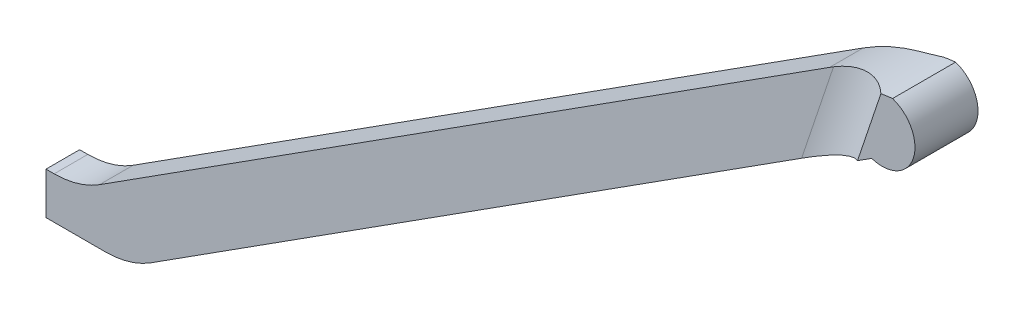
ISO-10303-21;
HEADER;
FILE_DESCRIPTION(('STEP AP214'),'2;1');
FILE_NAME('part.step','',(''),(''),'','','');
FILE_SCHEMA(('AUTOMOTIVE_DESIGN { 1 0 10303 214 1 1 1 1 }'));
ENDSEC;
DATA;
#1=APPLICATION_CONTEXT('core data for automotive mechanical design processes');
#2=APPLICATION_PROTOCOL_DEFINITION('international standard','automotive_design',2000,#1);
#3=PRODUCT_CONTEXT('',#1,'mechanical');
#4=PRODUCT('Part','Part','',(#3));
#5=PRODUCT_RELATED_PRODUCT_CATEGORY('part','',(#4));
#6=PRODUCT_DEFINITION_FORMATION('','',#4);
#7=PRODUCT_DEFINITION_CONTEXT('part definition',#1,'design');
#8=PRODUCT_DEFINITION('design','',#6,#7);
#9=PRODUCT_DEFINITION_SHAPE('','',#8);
#10=(LENGTH_UNIT() NAMED_UNIT(*) SI_UNIT(.MILLI.,.METRE.));
#11=(NAMED_UNIT(*) PLANE_ANGLE_UNIT() SI_UNIT($,.RADIAN.));
#12=(NAMED_UNIT(*) SI_UNIT($,.STERADIAN.) SOLID_ANGLE_UNIT());
#13=UNCERTAINTY_MEASURE_WITH_UNIT(LENGTH_MEASURE(1.E-05),#10,'distance_accuracy_value','');
#14=(GEOMETRIC_REPRESENTATION_CONTEXT(3) GLOBAL_UNCERTAINTY_ASSIGNED_CONTEXT((#13)) GLOBAL_UNIT_ASSIGNED_CONTEXT((#10,
#11,#12)) REPRESENTATION_CONTEXT('',''));
#15=CARTESIAN_POINT('',(0.,0.,0.));
#16=DIRECTION('',(0.,0.,1.));
#17=DIRECTION('',(1.,0.,0.));
#18=AXIS2_PLACEMENT_3D('',#15,#16,#17);
#19=CARTESIAN_POINT('',(0.,0.,0.4));
#20=DIRECTION('',(0.,0.,1.));
#21=DIRECTION('',(1.,0.,0.));
#22=AXIS2_PLACEMENT_3D('',#19,#20,#21);
#23=PLANE('',#22);
#24=DIRECTION('',(0.317868783197725,0.948134714409507,0.));
#25=VECTOR('',#24,1.);
#26=CARTESIAN_POINT('',(19.3181408029829,14.2125308811986,0.4));
#27=LINE('',#26,#25);
#28=CARTESIAN_POINT('',(17.9768362564933,10.2117057912715,0.4));
#29=VERTEX_POINT('',#28);
#30=CARTESIAN_POINT('',(18.7358241223497,12.4756045491009,0.4));
#31=VERTEX_POINT('',#30);
#32=EDGE_CURVE('E251',#29,#31,#27,.T.);
#33=ORIENTED_EDGE('',*,*,#32,.T.);
#34=CARTESIAN_POINT('',(21.3354097077884,8.20452098822553,0.4));
#35=DIRECTION('',(0.,0.,1.));
#36=DIRECTION('',(1.,0.,0.));
#37=AXIS2_PLACEMENT_3D('',#34,#35,#36);
#38=CIRCLE('',#37,5.);
#39=CARTESIAN_POINT('',(18.6426614162399,12.4174898509591,0.4));
#40=VERTEX_POINT('',#39);
#41=EDGE_CURVE('E11',#31,#40,#38,.T.);
#42=ORIENTED_EDGE('',*,*,#41,.T.);
#43=DIRECTION('',(-0.842593772546712,-0.538549658309705,0.));
#44=VECTOR('',#43,1.);
#45=CARTESIAN_POINT('',(21.0542795139686,13.9588922975731,0.4));
#46=LINE('',#45,#44);
#47=CARTESIAN_POINT('',(1.27184576690722,1.31481245490657,0.4));
#48=VERTEX_POINT('',#47);
#49=EDGE_CURVE('E189',#40,#48,#46,.T.);
#50=ORIENTED_EDGE('',*,*,#49,.T.);
#51=CARTESIAN_POINT('',(0.194746450287808,3.,0.4));
#52=DIRECTION('',(0.,0.,1.));
#53=DIRECTION('',(1.,0.,0.));
#54=AXIS2_PLACEMENT_3D('',#51,#52,#53);
#55=CIRCLE('',#54,2.);
#56=CARTESIAN_POINT('',(0.194746450287807,1.,0.4));
#57=VERTEX_POINT('',#56);
#58=EDGE_CURVE('E246',#48,#57,#55,.F.);
#59=ORIENTED_EDGE('',*,*,#58,.T.);
#60=DIRECTION('',(-1.,0.,0.));
#61=VECTOR('',#60,1.);
#62=CARTESIAN_POINT('',(0.779302488991181,1.,0.4));
#63=LINE('',#62,#61);
#64=CARTESIAN_POINT('',(0.,1.,0.4));
#65=VERTEX_POINT('',#64);
#66=EDGE_CURVE('E192',#57,#65,#63,.T.);
#67=ORIENTED_EDGE('',*,*,#66,.T.);
#68=DIRECTION('',(0.,-1.,0.));
#69=VECTOR('',#68,1.);
#70=CARTESIAN_POINT('',(0.,1.,0.4));
#71=LINE('',#70,#69);
#72=CARTESIAN_POINT('',(0.,0.,0.4));
#73=VERTEX_POINT('',#72);
#74=EDGE_CURVE('E176',#65,#73,#71,.T.);
#75=ORIENTED_EDGE('',*,*,#74,.T.);
#76=DIRECTION('',(1.,0.,0.));
#77=VECTOR('',#76,1.);
#78=CARTESIAN_POINT('',(0.,0.,0.4));
#79=LINE('',#78,#77);
#80=CARTESIAN_POINT('',(1.41544396129663,0.,0.4));
#81=VERTEX_POINT('',#80);
#82=EDGE_CURVE('E180',#73,#81,#79,.T.);
#83=ORIENTED_EDGE('',*,*,#82,.T.);
#84=CARTESIAN_POINT('',(1.41544396129663,2.,0.4));
#85=DIRECTION('',(0.,0.,1.));
#86=DIRECTION('',(1.,0.,0.));
#87=AXIS2_PLACEMENT_3D('',#84,#85,#86);
#88=CIRCLE('',#87,2.);
#89=CARTESIAN_POINT('',(2.49254327791604,0.314812454906576,0.4));
#90=VERTEX_POINT('',#89);
#91=EDGE_CURVE('E231',#81,#90,#88,.T.);
#92=ORIENTED_EDGE('',*,*,#91,.T.);
#93=DIRECTION('',(0.842593772546712,0.538549658309705,0.));
#94=VECTOR('',#93,1.);
#95=CARTESIAN_POINT('',(2.,0.,0.4));
#96=LINE('',#95,#94);
#97=EDGE_CURVE('E185',#90,#29,#96,.T.);
#98=ORIENTED_EDGE('',*,*,#97,.T.);
#99=EDGE_LOOP('',(#33,#42,#50,#59,#67,#75,#83,#92,#98));
#100=FACE_BOUND('',#99,.T.);
#101=ADVANCED_FACE('F40',(#100),#23,.T.);
#102=CARTESIAN_POINT('',(0.,0.,-0.4));
#103=DIRECTION('',(0.,0.,1.));
#104=DIRECTION('',(1.,0.,0.));
#105=AXIS2_PLACEMENT_3D('',#102,#103,#104);
#106=PLANE('',#105);
#107=DIRECTION('',(-0.842593772546712,-0.538549658309705,0.));
#108=VECTOR('',#107,1.);
#109=CARTESIAN_POINT('',(21.0542795139686,13.9588922975731,-0.4));
#110=LINE('',#109,#108);
#111=CARTESIAN_POINT('',(18.6426614162399,12.4174898509591,-0.4));
#112=VERTEX_POINT('',#111);
#113=CARTESIAN_POINT('',(1.27184576690722,1.31481245490657,-0.4));
#114=VERTEX_POINT('',#113);
#115=EDGE_CURVE('E207',#112,#114,#110,.T.);
#116=ORIENTED_EDGE('',*,*,#115,.F.);
#117=CARTESIAN_POINT('',(21.3354097077884,8.20452098822553,-0.4));
#118=DIRECTION('',(0.,0.,1.));
#119=DIRECTION('',(1.,0.,0.));
#120=AXIS2_PLACEMENT_3D('',#117,#118,#119);
#121=CIRCLE('',#120,5.);
#122=CARTESIAN_POINT('',(20.0076503823272,13.0250038658687,-0.4));
#123=VERTEX_POINT('',#122);
#124=EDGE_CURVE('E261',#112,#123,#121,.F.);
#125=ORIENTED_EDGE('',*,*,#124,.T.);
#126=DIRECTION('',(-0.317868783197725,-0.948134714409507,0.));
#127=VECTOR('',#126,1.);
#128=CARTESIAN_POINT('',(14.0605588272514,-4.71390052233451,-0.4));
#129=LINE('',#128,#127);
#130=CARTESIAN_POINT('',(19.3610937940926,11.0964636047948,-0.4));
#131=VERTEX_POINT('',#130);
#132=EDGE_CURVE('E249',#123,#131,#129,.T.);
#133=ORIENTED_EDGE('',*,*,#132,.T.);
#134=DIRECTION('',(0.842593772546712,0.538549658309705,0.));
#135=VECTOR('',#134,1.);
#136=CARTESIAN_POINT('',(2.,0.,-0.4));
#137=LINE('',#136,#135);
#138=CARTESIAN_POINT('',(2.49254327791604,0.314812454906576,-0.4));
#139=VERTEX_POINT('',#138);
#140=EDGE_CURVE('E203',#139,#131,#137,.T.);
#141=ORIENTED_EDGE('',*,*,#140,.F.);
#142=CARTESIAN_POINT('',(1.41544396129663,2.,-0.4));
#143=DIRECTION('',(0.,0.,1.));
#144=DIRECTION('',(1.,0.,0.));
#145=AXIS2_PLACEMENT_3D('',#142,#143,#144);
#146=CIRCLE('',#145,2.);
#147=CARTESIAN_POINT('',(1.41544396129663,0.,-0.4));
#148=VERTEX_POINT('',#147);
#149=EDGE_CURVE('E225',#139,#148,#146,.F.);
#150=ORIENTED_EDGE('',*,*,#149,.T.);
#151=DIRECTION('',(1.,0.,0.));
#152=VECTOR('',#151,1.);
#153=CARTESIAN_POINT('',(0.,0.,-0.4));
#154=LINE('',#153,#152);
#155=CARTESIAN_POINT('',(0.,0.,-0.4));
#156=VERTEX_POINT('',#155);
#157=EDGE_CURVE('E199',#156,#148,#154,.T.);
#158=ORIENTED_EDGE('',*,*,#157,.F.);
#159=DIRECTION('',(0.,-1.,0.));
#160=VECTOR('',#159,1.);
#161=CARTESIAN_POINT('',(0.,1.,-0.4));
#162=LINE('',#161,#160);
#163=CARTESIAN_POINT('',(0.,1.,-0.4));
#164=VERTEX_POINT('',#163);
#165=EDGE_CURVE('E173',#164,#156,#162,.T.);
#166=ORIENTED_EDGE('',*,*,#165,.F.);
#167=DIRECTION('',(-1.,0.,0.));
#168=VECTOR('',#167,1.);
#169=CARTESIAN_POINT('',(0.779302488991181,1.,-0.4));
#170=LINE('',#169,#168);
#171=CARTESIAN_POINT('',(0.194746450287807,1.,-0.4));
#172=VERTEX_POINT('',#171);
#173=EDGE_CURVE('E181',#172,#164,#170,.T.);
#174=ORIENTED_EDGE('',*,*,#173,.F.);
#175=CARTESIAN_POINT('',(0.194746450287808,3.,-0.4));
#176=DIRECTION('',(0.,0.,1.));
#177=DIRECTION('',(1.,0.,0.));
#178=AXIS2_PLACEMENT_3D('',#175,#176,#177);
#179=CIRCLE('',#178,2.);
#180=EDGE_CURVE('E242',#172,#114,#179,.T.);
#181=ORIENTED_EDGE('',*,*,#180,.T.);
#182=EDGE_LOOP('',(#116,#125,#133,#141,#150,#158,#166,#174,#181));
#183=FACE_BOUND('',#182,.T.);
#184=ADVANCED_FACE('F288',(#183),#106,.F.);
#185=CARTESIAN_POINT('',(0.,1.,0.4));
#186=DIRECTION('',(1.,0.,0.));
#187=DIRECTION('',(0.,1.,0.));
#188=AXIS2_PLACEMENT_3D('',#185,#186,#187);
#189=PLANE('',#188);
#190=ORIENTED_EDGE('',*,*,#165,.T.);
#191=DIRECTION('',(0.,0.,-1.));
#192=VECTOR('',#191,1.);
#193=CARTESIAN_POINT('',(0.,0.,0.4));
#194=LINE('',#193,#192);
#195=EDGE_CURVE('E217',#73,#156,#194,.T.);
#196=ORIENTED_EDGE('',*,*,#195,.F.);
#197=ORIENTED_EDGE('',*,*,#74,.F.);
#198=DIRECTION('',(0.,0.,-1.));
#199=VECTOR('',#198,1.);
#200=CARTESIAN_POINT('',(0.,1.,0.4));
#201=LINE('',#200,#199);
#202=EDGE_CURVE('E195',#65,#164,#201,.T.);
#203=ORIENTED_EDGE('',*,*,#202,.T.);
#204=EDGE_LOOP('',(#190,#196,#197,#203));
#205=FACE_BOUND('',#204,.T.);
#206=ADVANCED_FACE('F294',(#205),#189,.F.);
#207=CARTESIAN_POINT('',(0.,0.,0.4));
#208=DIRECTION('',(0.,1.,0.));
#209=DIRECTION('',(0.,0.,1.));
#210=AXIS2_PLACEMENT_3D('',#207,#208,#209);
#211=PLANE('',#210);
#212=ORIENTED_EDGE('',*,*,#157,.T.);
#213=DIRECTION('',(0.,0.,-1.));
#214=VECTOR('',#213,1.);
#215=CARTESIAN_POINT('',(1.41544396129663,0.,0.4));
#216=LINE('',#215,#214);
#217=EDGE_CURVE('E228',#148,#81,#216,.F.);
#218=ORIENTED_EDGE('',*,*,#217,.T.);
#219=ORIENTED_EDGE('',*,*,#82,.F.);
#220=ORIENTED_EDGE('',*,*,#195,.T.);
#221=EDGE_LOOP('',(#212,#218,#219,#220));
#222=FACE_BOUND('',#221,.T.);
#223=ADVANCED_FACE('F312',(#222),#211,.F.);
#224=CARTESIAN_POINT('',(2.,0.,0.4));
#225=DIRECTION('',(-0.538549658309705,0.842593772546712,0.));
#226=DIRECTION('',(-0.842593772546712,-0.538549658309705,0.));
#227=AXIS2_PLACEMENT_3D('',#224,#225,#226);
#228=PLANE('',#227);
#229=ORIENTED_EDGE('',*,*,#97,.F.);
#230=DIRECTION('',(0.,0.,-1.));
#231=VECTOR('',#230,1.);
#232=CARTESIAN_POINT('',(2.49254327791604,0.314812454906576,0.4));
#233=LINE('',#232,#231);
#234=EDGE_CURVE('E221',#90,#139,#233,.T.);
#235=ORIENTED_EDGE('',*,*,#234,.T.);
#236=ORIENTED_EDGE('',*,*,#140,.T.);
#237=CARTESIAN_POINT('',(19.3610937940926,11.0964636047948,-2.4));
#238=DIRECTION('',(-0.538549658309705,0.842593772546712,0.));
#239=DIRECTION('',(-0.842593772546712,-0.538549658309705,0.));
#240=AXIS2_PLACEMENT_3D('',#237,#238,#239);
#241=ELLIPSE('',#240,3.18621373077058,2.);
#242=CARTESIAN_POINT('',(19.9576435937439,11.4777525499954,-0.45));
#243=VERTEX_POINT('',#242);
#244=EDGE_CURVE('E253',#131,#243,#241,.T.);
#245=ORIENTED_EDGE('',*,*,#244,.T.);
#246=DIRECTION('',(0.842593772546711,0.538549658309705,0.));
#247=VECTOR('',#246,1.);
#248=CARTESIAN_POINT('',(19.9576435937439,11.4777525499954,-0.45));
#249=LINE('',#248,#247);
#250=CARTESIAN_POINT('',(20.2946811027626,11.6931724133193,-0.45));
#251=VERTEX_POINT('',#250);
#252=EDGE_CURVE('E171',#243,#251,#249,.T.);
#253=ORIENTED_EDGE('',*,*,#252,.T.);
#254=DIRECTION('',(0.,0.,-1.));
#255=VECTOR('',#254,1.);
#256=CARTESIAN_POINT('',(20.2946811027626,11.6931724133193,0.4));
#257=LINE('',#256,#255);
#258=CARTESIAN_POINT('',(20.2946811027626,11.6931724133193,1.05));
#259=VERTEX_POINT('',#258);
#260=EDGE_CURVE('E215',#259,#251,#257,.T.);
#261=ORIENTED_EDGE('',*,*,#260,.F.);
#262=DIRECTION('',(0.842593772546711,0.538549658309705,0.));
#263=VECTOR('',#262,1.);
#264=CARTESIAN_POINT('',(19.9576435937439,11.4777525499954,1.05));
#265=LINE('',#264,#263);
#266=CARTESIAN_POINT('',(19.9576435937439,11.4777525499954,1.05));
#267=VERTEX_POINT('',#266);
#268=EDGE_CURVE('E165',#267,#259,#265,.T.);
#269=ORIENTED_EDGE('',*,*,#268,.F.);
#270=CARTESIAN_POINT('',(17.9768362564933,10.2117057912715,2.4));
#271=DIRECTION('',(-0.538549658309705,0.842593772546712,0.));
#272=DIRECTION('',(-0.842593772546712,-0.538549658309705,0.));
#273=AXIS2_PLACEMENT_3D('',#270,#271,#272);
#274=ELLIPSE('',#273,3.18621373077058,2.);
#275=EDGE_CURVE('E256',#267,#29,#274,.T.);
#276=ORIENTED_EDGE('',*,*,#275,.T.);
#277=EDGE_LOOP('',(#229,#235,#236,#245,#253,#261,#269,#276));
#278=FACE_BOUND('',#277,.T.);
#279=ADVANCED_FACE('F308',(#278),#228,.F.);
#280=CARTESIAN_POINT('',(21.0542795139686,13.9588922975731,0.4));
#281=DIRECTION('',(0.538549658309705,-0.842593772546712,0.));
#282=DIRECTION('',(0.842593772546712,0.538549658309705,0.));
#283=AXIS2_PLACEMENT_3D('',#280,#281,#282);
#284=PLANE('',#283);
#285=ORIENTED_EDGE('',*,*,#49,.F.);
#286=DIRECTION('',(0.,0.,-1.));
#287=VECTOR('',#286,1.);
#288=CARTESIAN_POINT('',(18.6426614162399,12.4174898509591,0.4));
#289=LINE('',#288,#287);
#290=EDGE_CURVE('E258',#40,#112,#289,.T.);
#291=ORIENTED_EDGE('',*,*,#290,.T.);
#292=ORIENTED_EDGE('',*,*,#115,.T.);
#293=DIRECTION('',(0.,0.,-1.));
#294=VECTOR('',#293,1.);
#295=CARTESIAN_POINT('',(1.27184576690722,1.31481245490658,0.4));
#296=LINE('',#295,#294);
#297=EDGE_CURVE('E238',#114,#48,#296,.F.);
#298=ORIENTED_EDGE('',*,*,#297,.T.);
#299=EDGE_LOOP('',(#285,#291,#292,#298));
#300=FACE_BOUND('',#299,.T.);
#301=ADVANCED_FACE('F304',(#300),#284,.F.);
#302=CARTESIAN_POINT('',(0.779302488991181,1.,0.4));
#303=DIRECTION('',(0.,-1.,0.));
#304=DIRECTION('',(1.,0.,0.));
#305=AXIS2_PLACEMENT_3D('',#302,#303,#304);
#306=PLANE('',#305);
#307=ORIENTED_EDGE('',*,*,#66,.F.);
#308=DIRECTION('',(0.,0.,-1.));
#309=VECTOR('',#308,1.);
#310=CARTESIAN_POINT('',(0.194746450287807,1.,-0.4));
#311=LINE('',#310,#309);
#312=EDGE_CURVE('E234',#57,#172,#311,.T.);
#313=ORIENTED_EDGE('',*,*,#312,.T.);
#314=ORIENTED_EDGE('',*,*,#173,.T.);
#315=ORIENTED_EDGE('',*,*,#202,.F.);
#316=EDGE_LOOP('',(#307,#313,#314,#315));
#317=FACE_BOUND('',#316,.T.);
#318=ADVANCED_FACE('F301',(#317),#306,.F.);
#319=CARTESIAN_POINT('',(0.,0.,-0.45));
#320=DIRECTION('',(0.,0.,1.));
#321=DIRECTION('',(1.,0.,0.));
#322=AXIS2_PLACEMENT_3D('',#319,#320,#321);
#323=PLANE('',#322);
#324=DIRECTION('',(-0.317868783197725,-0.948134714409507,0.));
#325=VECTOR('',#324,1.);
#326=CARTESIAN_POINT('',(20.7172420049499,13.7434724342493,-0.45));
#327=LINE('',#326,#325);
#328=CARTESIAN_POINT('',(20.5137667735545,13.1365492615248,-0.45));
#329=VERTEX_POINT('',#328);
#330=EDGE_CURVE('E160',#329,#243,#327,.T.);
#331=ORIENTED_EDGE('',*,*,#330,.F.);
#332=CARTESIAN_POINT('',(21.3354097077884,8.20452098822553,-0.45));
#333=DIRECTION('',(0.,0.,1.));
#334=DIRECTION('',(1.,0.,0.));
#335=AXIS2_PLACEMENT_3D('',#332,#333,#334);
#336=CIRCLE('',#335,5.);
#337=CARTESIAN_POINT('',(20.7914206702024,13.1748404877131,-0.45));
#338=VERTEX_POINT('',#337);
#339=EDGE_CURVE('E151',#329,#338,#336,.F.);
#340=ORIENTED_EDGE('',*,*,#339,.T.);
#341=CARTESIAN_POINT('',(20.5430508864825,12.4340064505162,-0.45));
#342=DIRECTION('',(0.,0.,1.));
#343=DIRECTION('',(-1.,0.,0.));
#344=AXIS2_PLACEMENT_3D('',#341,#342,#343);
#345=CIRCLE('',#344,0.781359469216677);
#346=EDGE_CURVE('E159',#251,#338,#345,.T.);
#347=ORIENTED_EDGE('',*,*,#346,.F.);
#348=ORIENTED_EDGE('',*,*,#252,.F.);
#349=EDGE_LOOP('',(#331,#340,#347,#348));
#350=FACE_BOUND('',#349,.T.);
#351=ADVANCED_FACE('F298',(#350),#323,.F.);
#352=CARTESIAN_POINT('',(0.,0.,1.05));
#353=DIRECTION('',(0.,0.,1.));
#354=DIRECTION('',(1.,0.,0.));
#355=AXIS2_PLACEMENT_3D('',#352,#353,#354);
#356=PLANE('',#355);
#357=ORIENTED_EDGE('',*,*,#268,.T.);
#358=CARTESIAN_POINT('',(20.5430508864825,12.4340064505162,1.05));
#359=DIRECTION('',(0.,0.,1.));
#360=DIRECTION('',(-1.,0.,0.));
#361=AXIS2_PLACEMENT_3D('',#358,#359,#360);
#362=CIRCLE('',#361,0.781359469216677);
#363=CARTESIAN_POINT('',(20.7914206702024,13.1748404877131,1.05));
#364=VERTEX_POINT('',#363);
#365=EDGE_CURVE('E157',#259,#364,#362,.T.);
#366=ORIENTED_EDGE('',*,*,#365,.T.);
#367=CARTESIAN_POINT('',(21.3354097077884,8.20452098822553,1.05));
#368=DIRECTION('',(0.,0.,1.));
#369=DIRECTION('',(1.,0.,0.));
#370=AXIS2_PLACEMENT_3D('',#367,#368,#369);
#371=CIRCLE('',#370,5.);
#372=CARTESIAN_POINT('',(20.5137667735545,13.1365492615248,1.05));
#373=VERTEX_POINT('',#372);
#374=EDGE_CURVE('E63',#364,#373,#371,.T.);
#375=ORIENTED_EDGE('',*,*,#374,.T.);
#376=DIRECTION('',(-0.317868783197725,-0.948134714409507,0.));
#377=VECTOR('',#376,1.);
#378=CARTESIAN_POINT('',(20.7172420049499,13.7434724342493,1.05));
#379=LINE('',#378,#377);
#380=EDGE_CURVE('E169',#373,#267,#379,.T.);
#381=ORIENTED_EDGE('',*,*,#380,.T.);
#382=EDGE_LOOP('',(#357,#366,#375,#381));
#383=FACE_BOUND('',#382,.T.);
#384=ADVANCED_FACE('F163',(#383),#356,.T.);
#385=CARTESIAN_POINT('',(1.41544396129663,2.,0.4));
#386=DIRECTION('',(0.,0.,-1.));
#387=DIRECTION('',(-1.,0.,0.));
#388=AXIS2_PLACEMENT_3D('',#385,#386,#387);
#389=CYLINDRICAL_SURFACE('',#388,2.);
#390=ORIENTED_EDGE('',*,*,#91,.F.);
#391=ORIENTED_EDGE('',*,*,#217,.F.);
#392=ORIENTED_EDGE('',*,*,#149,.F.);
#393=ORIENTED_EDGE('',*,*,#234,.F.);
#394=EDGE_LOOP('',(#390,#391,#392,#393));
#395=FACE_BOUND('',#394,.T.);
#396=ADVANCED_FACE('F319',(#395),#389,.T.);
#397=CARTESIAN_POINT('',(0.194746450287808,3.,0.4));
#398=DIRECTION('',(0.,0.,1.));
#399=DIRECTION('',(1.,0.,0.));
#400=AXIS2_PLACEMENT_3D('',#397,#398,#399);
#401=CYLINDRICAL_SURFACE('',#400,2.);
#402=ORIENTED_EDGE('',*,*,#58,.F.);
#403=ORIENTED_EDGE('',*,*,#297,.F.);
#404=ORIENTED_EDGE('',*,*,#180,.F.);
#405=ORIENTED_EDGE('',*,*,#312,.F.);
#406=EDGE_LOOP('',(#402,#403,#404,#405));
#407=FACE_BOUND('',#406,.T.);
#408=ADVANCED_FACE('F275',(#407),#401,.F.);
#409=CARTESIAN_POINT('',(20.295881721176,13.8847364114621,-2.4));
#410=DIRECTION('',(-0.317868783197725,-0.948134714409507,0.));
#411=DIRECTION('',(0.948134714409507,-0.317868783197725,0.));
#412=AXIS2_PLACEMENT_3D('',#409,#410,#411);
#413=CYLINDRICAL_SURFACE('',#412,2.);
#414=ORIENTED_EDGE('',*,*,#132,.F.);
#415=CARTESIAN_POINT('',(20.0076503823272,13.0250038658687,-0.4));
#416=CARTESIAN_POINT('',(20.0496300066291,13.0365687574048,-0.399999298266848));
#417=CARTESIAN_POINT('',(20.0917663653143,13.0475828425355,-0.400978950074275));
#418=CARTESIAN_POINT('',(20.1760866839277,13.0684541730428,-0.404991369656194));
#419=CARTESIAN_POINT('',(20.2182700845597,13.0783149226741,-0.408017718141228));
#420=CARTESIAN_POINT('',(20.302684756752,13.0968973529405,-0.416214954248356));
#421=CARTESIAN_POINT('',(20.3449160308452,13.1056189701689,-0.421385961180212));
#422=CARTESIAN_POINT('',(20.4293991510503,13.1219397858004,-0.433978119908787));
#423=CARTESIAN_POINT('',(20.4716506473601,13.1295353833819,-0.441406268155316));
#424=CARTESIAN_POINT('',(20.5137667735545,13.1365492615248,-0.449999999999999));
#425=B_SPLINE_CURVE_WITH_KNOTS('',3,(#415,#416,#417,#418,#419,#420,#421,#422,#423,#424),
.UNSPECIFIED.,.F.,.F.,(4,2,2,2,4),(0.,0.130622698035264,0.260837597534917,0.391059742007833,
0.521689725836861),.UNSPECIFIED.);
#426=EDGE_CURVE('E263',#123,#329,#425,.T.);
#427=ORIENTED_EDGE('',*,*,#426,.T.);
#428=ORIENTED_EDGE('',*,*,#330,.T.);
#429=ORIENTED_EDGE('',*,*,#244,.F.);
#430=EDGE_LOOP('',(#414,#427,#428,#429));
#431=FACE_BOUND('',#430,.T.);
#432=ADVANCED_FACE('F270',(#431),#413,.F.);
#433=CARTESIAN_POINT('',(19.3181408029829,14.2125308811986,2.4));
#434=DIRECTION('',(-0.317868783197725,-0.948134714409507,0.));
#435=DIRECTION('',(0.948134714409507,-0.317868783197725,0.));
#436=AXIS2_PLACEMENT_3D('',#433,#434,#435);
#437=CYLINDRICAL_SURFACE('',#436,2.);
#438=ORIENTED_EDGE('',*,*,#380,.F.);
#439=CARTESIAN_POINT('',(20.5137667735545,13.1365492615248,1.05));
#440=CARTESIAN_POINT('',(20.4715310674888,13.1295190531725,1.00865225068884));
#441=CARTESIAN_POINT('',(20.4275203508887,13.1216239613725,0.969289309827436));
#442=CARTESIAN_POINT('',(20.3365430095346,13.1039490412076,0.894687266474353));
#443=CARTESIAN_POINT('',(20.2895787904647,13.0941707337036,0.859444872942693));
#444=CARTESIAN_POINT('',(20.193714150792,13.0726746922689,0.793511911577805));
#445=CARTESIAN_POINT('',(20.1448385993691,13.0609779304175,0.762778272797576));
#446=CARTESIAN_POINT('',(20.0452593175425,13.0354796379147,0.705438151516384));
#447=CARTESIAN_POINT('',(19.9945553307869,13.0216778112442,0.678832250530511));
#448=CARTESIAN_POINT('',(19.8407852466056,12.9770890874375,0.605262483217801));
#449=CARTESIAN_POINT('',(19.7357200079612,12.9430452537281,0.564317757899689));
#450=CARTESIAN_POINT('',(19.5237657628453,12.8661458328949,0.497123570827221));
#451=CARTESIAN_POINT('',(19.4168710054667,12.82325433712,0.470935669491302));
#452=CARTESIAN_POINT('',(19.2123730817912,12.7326856508542,0.43285874989159));
#453=CARTESIAN_POINT('',(19.1146722607267,12.6856051975013,0.420047821894461));
#454=CARTESIAN_POINT('',(18.9705027262176,12.6102153213684,0.407734964189731));
#455=CARTESIAN_POINT('',(18.9229847099888,12.5843766144251,0.404779877152456));
#456=CARTESIAN_POINT('',(18.828767835389,12.5311446233422,0.400913787738771));
#457=CARTESIAN_POINT('',(18.7820686393665,12.5037520007041,0.400001922160063));
#458=CARTESIAN_POINT('',(18.7358241223497,12.4756045491009,0.4));
#459=B_SPLINE_CURVE_WITH_KNOTS('',3,(#439,#440,#441,#442,#443,#444,#445,#446,#447,#448,#449,
#450,#451,#452,#453,#454,#455,#456,#457,#458),.UNSPECIFIED.,.F.,.F.,(4,2,2,2,2,2,2,2,2,4),(0.,
0.178477169625076,0.356810803222237,0.53331104877783,0.709836137126763,1.06164997806199,
1.4149208021875,1.74180522030641,1.90425802137552,2.06664217785822),.UNSPECIFIED.);
#460=EDGE_CURVE('E49',#373,#31,#459,.T.);
#461=ORIENTED_EDGE('',*,*,#460,.T.);
#462=ORIENTED_EDGE('',*,*,#32,.F.);
#463=ORIENTED_EDGE('',*,*,#275,.F.);
#464=EDGE_LOOP('',(#438,#461,#462,#463));
#465=FACE_BOUND('',#464,.T.);
#466=ADVANCED_FACE('F274',(#465),#437,.F.);
#467=CARTESIAN_POINT('',(21.3354097077884,8.20452098822553,-0.45));
#468=DIRECTION('',(0.,0.,-1.));
#469=DIRECTION('',(-1.,0.,0.));
#470=AXIS2_PLACEMENT_3D('',#467,#468,#469);
#471=CYLINDRICAL_SURFACE('',#470,5.);
#472=ORIENTED_EDGE('',*,*,#374,.F.);
#473=DIRECTION('',(0.,0.,1.));
#474=VECTOR('',#473,1.);
#475=CARTESIAN_POINT('',(20.7914206702024,13.1748404877131,0.4));
#476=LINE('',#475,#474);
#477=EDGE_CURVE('E148',#338,#364,#476,.T.);
#478=ORIENTED_EDGE('',*,*,#477,.F.);
#479=ORIENTED_EDGE('',*,*,#339,.F.);
#480=ORIENTED_EDGE('',*,*,#426,.F.);
#481=ORIENTED_EDGE('',*,*,#124,.F.);
#482=ORIENTED_EDGE('',*,*,#290,.F.);
#483=ORIENTED_EDGE('',*,*,#41,.F.);
#484=ORIENTED_EDGE('',*,*,#460,.F.);
#485=EDGE_LOOP('',(#472,#478,#479,#480,#481,#482,#483,#484));
#486=FACE_BOUND('',#485,.T.);
#487=ADVANCED_FACE('F42',(#486),#471,.T.);
#488=CARTESIAN_POINT('',(20.5430508864825,12.4340064505162,-0.45));
#489=DIRECTION('',(0.,0.,1.));
#490=DIRECTION('',(1.,0.,0.));
#491=AXIS2_PLACEMENT_3D('',#488,#489,#490);
#492=CYLINDRICAL_SURFACE('',#491,0.781359469216677);
#493=ORIENTED_EDGE('',*,*,#365,.F.);
#494=ORIENTED_EDGE('',*,*,#260,.T.);
#495=ORIENTED_EDGE('',*,*,#346,.T.);
#496=ORIENTED_EDGE('',*,*,#477,.T.);
#497=EDGE_LOOP('',(#493,#494,#495,#496));
#498=FACE_BOUND('',#497,.T.);
#499=ADVANCED_FACE('F155',(#498),#492,.T.);
#500=CLOSED_SHELL('',(#101,#184,#206,#223,#279,#301,#318,#351,#384,#396,#408,#432,#466,#487,#499));
#501=MANIFOLD_SOLID_BREP('B2',#500);
#502=ADVANCED_BREP_SHAPE_REPRESENTATION('',(#18,#501),#14);
#503=SHAPE_DEFINITION_REPRESENTATION(#9,#502);
ENDSEC;
END-ISO-10303-21;
